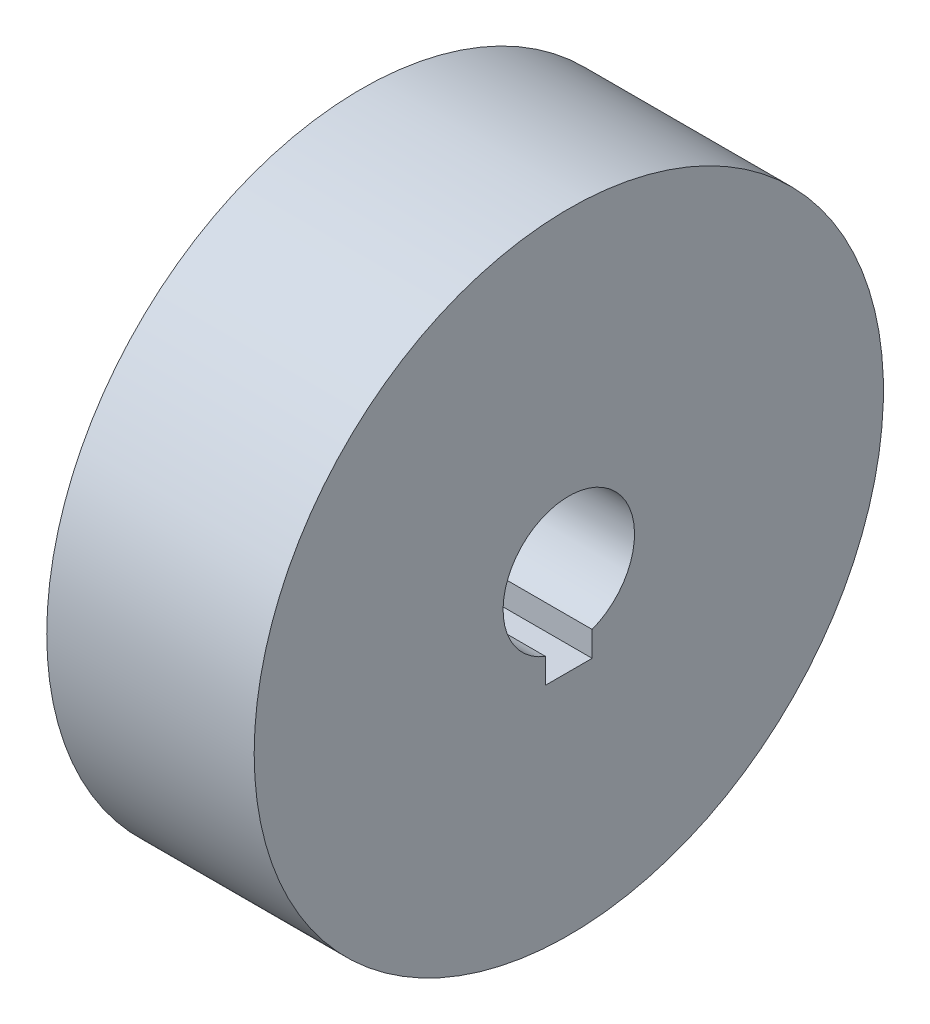
ISO-10303-21;
HEADER;
FILE_DESCRIPTION(('STEP AP214'),'2;1');
FILE_NAME('part.step','',(''),(''),'','','');
FILE_SCHEMA(('AUTOMOTIVE_DESIGN { 1 0 10303 214 1 1 1 1 }'));
ENDSEC;
DATA;
#1=APPLICATION_CONTEXT('core data for automotive mechanical design processes');
#2=APPLICATION_PROTOCOL_DEFINITION('international standard','automotive_design',2000,#1);
#3=PRODUCT_CONTEXT('',#1,'mechanical');
#4=PRODUCT('Part','Part','',(#3));
#5=PRODUCT_RELATED_PRODUCT_CATEGORY('part','',(#4));
#6=PRODUCT_DEFINITION_FORMATION('','',#4);
#7=PRODUCT_DEFINITION_CONTEXT('part definition',#1,'design');
#8=PRODUCT_DEFINITION('design','',#6,#7);
#9=PRODUCT_DEFINITION_SHAPE('','',#8);
#10=(LENGTH_UNIT() NAMED_UNIT(*) SI_UNIT(.MILLI.,.METRE.));
#11=(NAMED_UNIT(*) PLANE_ANGLE_UNIT() SI_UNIT($,.RADIAN.));
#12=(NAMED_UNIT(*) SI_UNIT($,.STERADIAN.) SOLID_ANGLE_UNIT());
#13=UNCERTAINTY_MEASURE_WITH_UNIT(LENGTH_MEASURE(1.E-05),#10,'distance_accuracy_value','');
#14=(GEOMETRIC_REPRESENTATION_CONTEXT(3) GLOBAL_UNCERTAINTY_ASSIGNED_CONTEXT((#13)) GLOBAL_UNIT_ASSIGNED_CONTEXT((#10,
#11,#12)) REPRESENTATION_CONTEXT('',''));
#15=CARTESIAN_POINT('',(0.,0.,0.));
#16=DIRECTION('',(0.,0.,1.));
#17=DIRECTION('',(1.,0.,0.));
#18=AXIS2_PLACEMENT_3D('',#15,#16,#17);
#19=CARTESIAN_POINT('',(-102.944705745188,-57.9201770636928,0.));
#20=DIRECTION('',(-1.,0.,0.));
#21=DIRECTION('',(0.,0.,1.));
#22=AXIS2_PLACEMENT_3D('',#19,#20,#21);
#23=CYLINDRICAL_SURFACE('',#22,37.9201770636928);
#24=CARTESIAN_POINT('',(-35.,-57.9201770636928,0.));
#25=DIRECTION('',(-1.,0.,0.));
#26=DIRECTION('',(0.,0.,1.));
#27=AXIS2_PLACEMENT_3D('',#24,#25,#26);
#28=CIRCLE('',#27,37.9201770636928);
#29=CARTESIAN_POINT('',(-35.,-57.9201770636928,37.9201770636928));
#30=VERTEX_POINT('',#29);
#31=EDGE_CURVE('E102',#30,#30,#28,.T.);
#32=ORIENTED_EDGE('',*,*,#31,.F.);
#33=EDGE_LOOP('',(#32));
#34=FACE_BOUND('',#33,.T.);
#35=CARTESIAN_POINT('',(-9.99999999999999,-57.9201770636928,0.));
#36=DIRECTION('',(-1.,0.,0.));
#37=DIRECTION('',(0.,0.,1.));
#38=AXIS2_PLACEMENT_3D('',#35,#36,#37);
#39=CIRCLE('',#38,37.9201770636928);
#40=CARTESIAN_POINT('',(-9.99999999999999,-57.9201770636928,37.9201770636928));
#41=VERTEX_POINT('',#40);
#42=EDGE_CURVE('E40',#41,#41,#39,.T.);
#43=ORIENTED_EDGE('',*,*,#42,.T.);
#44=EDGE_LOOP('',(#43));
#45=FACE_BOUND('',#44,.T.);
#46=ADVANCED_FACE('F33',(#34,#45),#23,.T.);
#47=CARTESIAN_POINT('',(-10.,-30.,0.));
#48=DIRECTION('',(-1.,0.,0.));
#49=DIRECTION('',(0.,0.,1.));
#50=AXIS2_PLACEMENT_3D('',#47,#48,#49);
#51=PLANE('',#50);
#52=ORIENTED_EDGE('',*,*,#42,.F.);
#53=EDGE_LOOP('',(#52));
#54=FACE_BOUND('',#53,.T.);
#55=DIRECTION('',(0.,0.,1.));
#56=VECTOR('',#55,1.);
#57=CARTESIAN_POINT('',(-10.,-68.3406557470906,0.));
#58=LINE('',#57,#56);
#59=CARTESIAN_POINT('',(-10.,-68.3406557470906,-2.81187520028198));
#60=VERTEX_POINT('',#59);
#61=CARTESIAN_POINT('',(-10.,-68.3406557470906,2.81187520028198));
#62=VERTEX_POINT('',#61);
#63=EDGE_CURVE('E80',#60,#62,#58,.T.);
#64=ORIENTED_EDGE('',*,*,#63,.T.);
#65=DIRECTION('',(0.,1.,0.));
#66=VECTOR('',#65,1.);
#67=CARTESIAN_POINT('',(-10.,-30.,2.81187520028198));
#68=LINE('',#67,#66);
#69=CARTESIAN_POINT('',(-10.,-65.324403058237,2.81187520028198));
#70=VERTEX_POINT('',#69);
#71=EDGE_CURVE('E100',#62,#70,#68,.T.);
#72=ORIENTED_EDGE('',*,*,#71,.T.);
#73=CARTESIAN_POINT('',(-10.,-57.9201770636928,0.));
#74=DIRECTION('',(-1.,0.,0.));
#75=DIRECTION('',(0.,0.,1.));
#76=AXIS2_PLACEMENT_3D('',#73,#74,#75);
#77=CIRCLE('',#76,7.9201770636928);
#78=CARTESIAN_POINT('',(-10.,-65.324403058237,-2.81187520028198));
#79=VERTEX_POINT('',#78);
#80=EDGE_CURVE('E119',#70,#79,#77,.T.);
#81=ORIENTED_EDGE('',*,*,#80,.T.);
#82=DIRECTION('',(0.,-1.,0.));
#83=VECTOR('',#82,1.);
#84=CARTESIAN_POINT('',(-10.,-30.,-2.81187520028198));
#85=LINE('',#84,#83);
#86=EDGE_CURVE('E96',#79,#60,#85,.T.);
#87=ORIENTED_EDGE('',*,*,#86,.T.);
#88=EDGE_LOOP('',(#64,#72,#81,#87));
#89=FACE_BOUND('',#88,.T.);
#90=ADVANCED_FACE('F125',(#54,#89),#51,.F.);
#91=CARTESIAN_POINT('',(-102.944705745188,-57.9201770636928,0.));
#92=DIRECTION('',(-1.,0.,0.));
#93=DIRECTION('',(0.,0.,1.));
#94=AXIS2_PLACEMENT_3D('',#91,#92,#93);
#95=CYLINDRICAL_SURFACE('',#94,7.92017706369279);
#96=ORIENTED_EDGE('',*,*,#80,.F.);
#97=DIRECTION('',(-1.,0.,0.));
#98=VECTOR('',#97,1.);
#99=CARTESIAN_POINT('',(-102.944705745188,-65.324403058237,2.81187520028198));
#100=LINE('',#99,#98);
#101=CARTESIAN_POINT('',(-35.,-65.324403058237,2.81187520028198));
#102=VERTEX_POINT('',#101);
#103=EDGE_CURVE('E54',#70,#102,#100,.T.);
#104=ORIENTED_EDGE('',*,*,#103,.T.);
#105=CARTESIAN_POINT('',(-35.,-57.9201770636928,0.));
#106=DIRECTION('',(-1.,0.,0.));
#107=DIRECTION('',(0.,0.,1.));
#108=AXIS2_PLACEMENT_3D('',#105,#106,#107);
#109=CIRCLE('',#108,7.92017706369279);
#110=CARTESIAN_POINT('',(-35.,-65.324403058237,-2.81187520028198));
#111=VERTEX_POINT('',#110);
#112=EDGE_CURVE('E117',#102,#111,#109,.T.);
#113=ORIENTED_EDGE('',*,*,#112,.T.);
#114=DIRECTION('',(-1.,0.,0.));
#115=VECTOR('',#114,1.);
#116=CARTESIAN_POINT('',(-102.944705745188,-65.324403058237,-2.81187520028198));
#117=LINE('',#116,#115);
#118=EDGE_CURVE('E46',#111,#79,#117,.F.);
#119=ORIENTED_EDGE('',*,*,#118,.T.);
#120=EDGE_LOOP('',(#96,#104,#113,#119));
#121=FACE_BOUND('',#120,.T.);
#122=ADVANCED_FACE('F128',(#121),#95,.F.);
#123=CARTESIAN_POINT('',(-35.,-50.,0.));
#124=DIRECTION('',(-1.,0.,0.));
#125=DIRECTION('',(0.,0.,1.));
#126=AXIS2_PLACEMENT_3D('',#123,#124,#125);
#127=PLANE('',#126);
#128=DIRECTION('',(0.,1.,0.));
#129=VECTOR('',#128,1.);
#130=CARTESIAN_POINT('',(-35.,-63.3400525076806,2.81187520028198));
#131=LINE('',#130,#129);
#132=CARTESIAN_POINT('',(-35.,-68.3406557470906,2.81187520028198));
#133=VERTEX_POINT('',#132);
#134=EDGE_CURVE('E90',#133,#102,#131,.T.);
#135=ORIENTED_EDGE('',*,*,#134,.F.);
#136=DIRECTION('',(0.,0.,1.));
#137=VECTOR('',#136,1.);
#138=CARTESIAN_POINT('',(-35.,-68.3406557470906,-2.81187520028198));
#139=LINE('',#138,#137);
#140=CARTESIAN_POINT('',(-35.,-68.3406557470906,-2.81187520028198));
#141=VERTEX_POINT('',#140);
#142=EDGE_CURVE('E77',#141,#133,#139,.T.);
#143=ORIENTED_EDGE('',*,*,#142,.F.);
#144=DIRECTION('',(0.,-1.,0.));
#145=VECTOR('',#144,1.);
#146=CARTESIAN_POINT('',(-35.,-50.,-2.81187520028198));
#147=LINE('',#146,#145);
#148=EDGE_CURVE('E11',#111,#141,#147,.T.);
#149=ORIENTED_EDGE('',*,*,#148,.F.);
#150=ORIENTED_EDGE('',*,*,#112,.F.);
#151=EDGE_LOOP('',(#135,#143,#149,#150));
#152=FACE_BOUND('',#151,.T.);
#153=CARTESIAN_POINT('',(-35.,-57.9201770636928,0.));
#154=DIRECTION('',(-1.,0.,0.));
#155=DIRECTION('',(0.,0.,1.));
#156=AXIS2_PLACEMENT_3D('',#153,#154,#155);
#157=CIRCLE('',#156,17.9201770636928);
#158=CARTESIAN_POINT('',(-35.,-57.9201770636928,17.9201770636928));
#159=VERTEX_POINT('',#158);
#160=EDGE_CURVE('E114',#159,#159,#157,.T.);
#161=ORIENTED_EDGE('',*,*,#160,.T.);
#162=EDGE_LOOP('',(#161));
#163=FACE_BOUND('',#162,.T.);
#164=ADVANCED_FACE('F88',(#152,#163),#127,.T.);
#165=CARTESIAN_POINT('',(-102.944705745188,-57.9201770636928,0.));
#166=DIRECTION('',(-1.,0.,0.));
#167=DIRECTION('',(0.,0.,1.));
#168=AXIS2_PLACEMENT_3D('',#165,#166,#167);
#169=CYLINDRICAL_SURFACE('',#168,17.9201770636928);
#170=CARTESIAN_POINT('',(-20.,-57.9201770636928,0.));
#171=DIRECTION('',(-1.,0.,0.));
#172=DIRECTION('',(0.,0.,1.));
#173=AXIS2_PLACEMENT_3D('',#170,#171,#172);
#174=CIRCLE('',#173,17.9201770636928);
#175=CARTESIAN_POINT('',(-20.,-57.9201770636928,17.9201770636928));
#176=VERTEX_POINT('',#175);
#177=EDGE_CURVE('E111',#176,#176,#174,.T.);
#178=ORIENTED_EDGE('',*,*,#177,.T.);
#179=EDGE_LOOP('',(#178));
#180=FACE_BOUND('',#179,.T.);
#181=ORIENTED_EDGE('',*,*,#160,.F.);
#182=EDGE_LOOP('',(#181));
#183=FACE_BOUND('',#182,.T.);
#184=ADVANCED_FACE('F136',(#180,#183),#169,.T.);
#185=CARTESIAN_POINT('',(-20.,-30.,0.));
#186=DIRECTION('',(-1.,0.,0.));
#187=DIRECTION('',(0.,0.,1.));
#188=AXIS2_PLACEMENT_3D('',#185,#186,#187);
#189=PLANE('',#188);
#190=CARTESIAN_POINT('',(-20.,-57.9201770636928,0.));
#191=DIRECTION('',(-1.,0.,0.));
#192=DIRECTION('',(0.,0.,1.));
#193=AXIS2_PLACEMENT_3D('',#190,#191,#192);
#194=CIRCLE('',#193,27.9201770636928);
#195=CARTESIAN_POINT('',(-20.,-57.9201770636928,27.9201770636928));
#196=VERTEX_POINT('',#195);
#197=EDGE_CURVE('E108',#196,#196,#194,.T.);
#198=ORIENTED_EDGE('',*,*,#197,.T.);
#199=EDGE_LOOP('',(#198));
#200=FACE_BOUND('',#199,.T.);
#201=ORIENTED_EDGE('',*,*,#177,.F.);
#202=EDGE_LOOP('',(#201));
#203=FACE_BOUND('',#202,.T.);
#204=ADVANCED_FACE('F154',(#200,#203),#189,.T.);
#205=CARTESIAN_POINT('',(-102.944705745188,-57.9201770636928,0.));
#206=DIRECTION('',(-1.,0.,0.));
#207=DIRECTION('',(0.,0.,1.));
#208=AXIS2_PLACEMENT_3D('',#205,#206,#207);
#209=CYLINDRICAL_SURFACE('',#208,27.9201770636928);
#210=CARTESIAN_POINT('',(-35.,-57.9201770636928,0.));
#211=DIRECTION('',(-1.,0.,0.));
#212=DIRECTION('',(0.,0.,1.));
#213=AXIS2_PLACEMENT_3D('',#210,#211,#212);
#214=CIRCLE('',#213,27.9201770636928);
#215=CARTESIAN_POINT('',(-35.,-57.9201770636928,27.9201770636928));
#216=VERTEX_POINT('',#215);
#217=EDGE_CURVE('E105',#216,#216,#214,.T.);
#218=ORIENTED_EDGE('',*,*,#217,.T.);
#219=EDGE_LOOP('',(#218));
#220=FACE_BOUND('',#219,.T.);
#221=ORIENTED_EDGE('',*,*,#197,.F.);
#222=EDGE_LOOP('',(#221));
#223=FACE_BOUND('',#222,.T.);
#224=ADVANCED_FACE('F148',(#220,#223),#209,.F.);
#225=CARTESIAN_POINT('',(-35.,-30.,0.));
#226=DIRECTION('',(-1.,0.,0.));
#227=DIRECTION('',(0.,0.,1.));
#228=AXIS2_PLACEMENT_3D('',#225,#226,#227);
#229=PLANE('',#228);
#230=ORIENTED_EDGE('',*,*,#31,.T.);
#231=EDGE_LOOP('',(#230));
#232=FACE_BOUND('',#231,.T.);
#233=ORIENTED_EDGE('',*,*,#217,.F.);
#234=EDGE_LOOP('',(#233));
#235=FACE_BOUND('',#234,.T.);
#236=ADVANCED_FACE('F144',(#232,#235),#229,.T.);
#237=CARTESIAN_POINT('',(15.,-63.3400525076806,2.81187520028198));
#238=DIRECTION('',(0.,0.,1.));
#239=DIRECTION('',(1.,0.,0.));
#240=AXIS2_PLACEMENT_3D('',#237,#238,#239);
#241=PLANE('',#240);
#242=DIRECTION('',(-1.,0.,0.));
#243=VECTOR('',#242,1.);
#244=CARTESIAN_POINT('',(15.,-68.3406557470906,2.81187520028198));
#245=LINE('',#244,#243);
#246=EDGE_CURVE('E82',#62,#133,#245,.T.);
#247=ORIENTED_EDGE('',*,*,#246,.T.);
#248=ORIENTED_EDGE('',*,*,#134,.T.);
#249=ORIENTED_EDGE('',*,*,#103,.F.);
#250=ORIENTED_EDGE('',*,*,#71,.F.);
#251=EDGE_LOOP('',(#247,#248,#249,#250));
#252=FACE_BOUND('',#251,.T.);
#253=ADVANCED_FACE('F147',(#252),#241,.F.);
#254=CARTESIAN_POINT('',(15.,-68.3406557470906,-2.81187520028198));
#255=DIRECTION('',(0.,-1.,0.));
#256=DIRECTION('',(0.,0.,-1.));
#257=AXIS2_PLACEMENT_3D('',#254,#255,#256);
#258=PLANE('',#257);
#259=DIRECTION('',(-1.,0.,0.));
#260=VECTOR('',#259,1.);
#261=CARTESIAN_POINT('',(15.,-68.3406557470906,-2.81187520028198));
#262=LINE('',#261,#260);
#263=EDGE_CURVE('E73',#60,#141,#262,.T.);
#264=ORIENTED_EDGE('',*,*,#263,.T.);
#265=ORIENTED_EDGE('',*,*,#142,.T.);
#266=ORIENTED_EDGE('',*,*,#246,.F.);
#267=ORIENTED_EDGE('',*,*,#63,.F.);
#268=EDGE_LOOP('',(#264,#265,#266,#267));
#269=FACE_BOUND('',#268,.T.);
#270=ADVANCED_FACE('F74',(#269),#258,.F.);
#271=CARTESIAN_POINT('',(15.,-63.3400525076806,-2.81187520028198));
#272=DIRECTION('',(0.,0.,-1.));
#273=DIRECTION('',(-1.,0.,0.));
#274=AXIS2_PLACEMENT_3D('',#271,#272,#273);
#275=PLANE('',#274);
#276=ORIENTED_EDGE('',*,*,#118,.F.);
#277=ORIENTED_EDGE('',*,*,#148,.T.);
#278=ORIENTED_EDGE('',*,*,#263,.F.);
#279=ORIENTED_EDGE('',*,*,#86,.F.);
#280=EDGE_LOOP('',(#276,#277,#278,#279));
#281=FACE_BOUND('',#280,.T.);
#282=ADVANCED_FACE('F84',(#281),#275,.F.);
#283=CLOSED_SHELL('',(#46,#90,#122,#164,#184,#204,#224,#236,#253,#270,#282));
#284=MANIFOLD_SOLID_BREP('B2',#283);
#285=ADVANCED_BREP_SHAPE_REPRESENTATION('',(#18,#284),#14);
#286=SHAPE_DEFINITION_REPRESENTATION(#9,#285);
ENDSEC;
END-ISO-10303-21;
